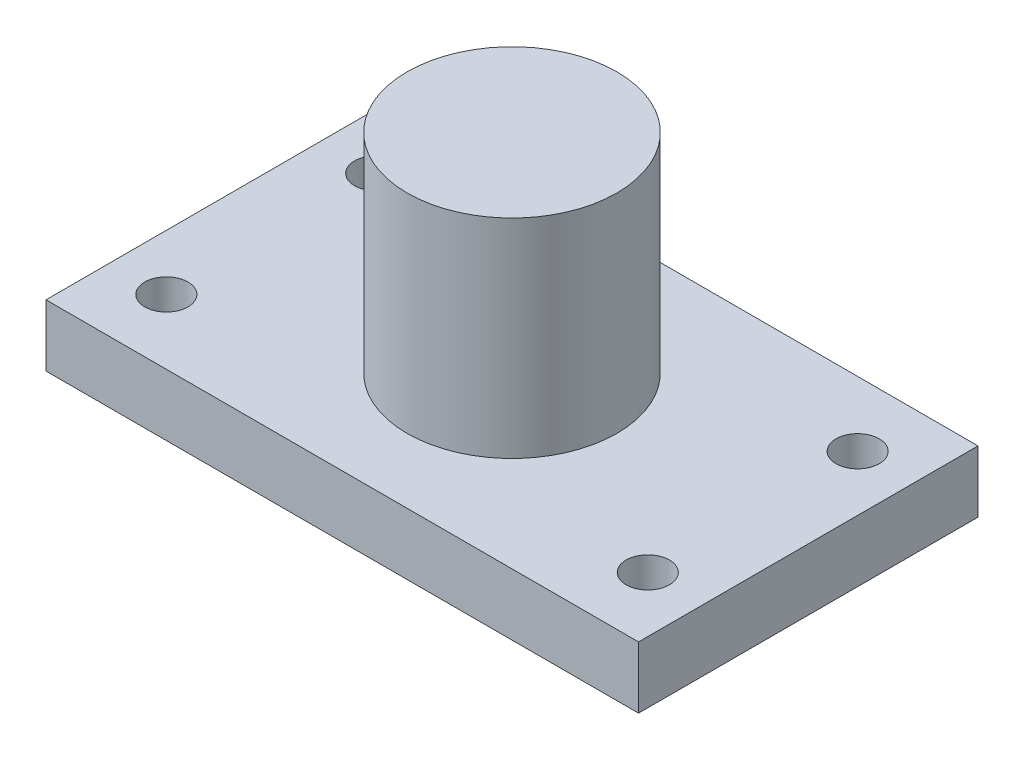
ISO-10303-21;
HEADER;
FILE_DESCRIPTION(('STEP AP214'),'2;1');
FILE_NAME('part.step','',(''),(''),'','','');
FILE_SCHEMA(('AUTOMOTIVE_DESIGN { 1 0 10303 214 1 1 1 1 }'));
ENDSEC;
DATA;
#1=APPLICATION_CONTEXT('core data for automotive mechanical design processes');
#2=APPLICATION_PROTOCOL_DEFINITION('international standard','automotive_design',2000,#1);
#3=PRODUCT_CONTEXT('',#1,'mechanical');
#4=PRODUCT('Part','Part','',(#3));
#5=PRODUCT_RELATED_PRODUCT_CATEGORY('part','',(#4));
#6=PRODUCT_DEFINITION_FORMATION('','',#4);
#7=PRODUCT_DEFINITION_CONTEXT('part definition',#1,'design');
#8=PRODUCT_DEFINITION('design','',#6,#7);
#9=PRODUCT_DEFINITION_SHAPE('','',#8);
#10=(LENGTH_UNIT() NAMED_UNIT(*) SI_UNIT(.MILLI.,.METRE.));
#11=(NAMED_UNIT(*) PLANE_ANGLE_UNIT() SI_UNIT($,.RADIAN.));
#12=(NAMED_UNIT(*) SI_UNIT($,.STERADIAN.) SOLID_ANGLE_UNIT());
#13=UNCERTAINTY_MEASURE_WITH_UNIT(LENGTH_MEASURE(1.E-05),#10,'distance_accuracy_value','');
#14=(GEOMETRIC_REPRESENTATION_CONTEXT(3) GLOBAL_UNCERTAINTY_ASSIGNED_CONTEXT((#13)) GLOBAL_UNIT_ASSIGNED_CONTEXT((#10,
#11,#12)) REPRESENTATION_CONTEXT('',''));
#15=CARTESIAN_POINT('',(0.,0.,0.));
#16=DIRECTION('',(0.,0.,1.));
#17=DIRECTION('',(1.,0.,0.));
#18=AXIS2_PLACEMENT_3D('',#15,#16,#17);
#19=CARTESIAN_POINT('',(0.,5.,0.));
#20=DIRECTION('',(1.,0.,0.));
#21=DIRECTION('',(0.,0.,-1.));
#22=AXIS2_PLACEMENT_3D('',#19,#20,#21);
#23=PLANE('',#22);
#24=DIRECTION('',(0.,0.,1.));
#25=VECTOR('',#24,1.);
#26=CARTESIAN_POINT('',(0.,0.,0.));
#27=LINE('',#26,#25);
#28=CARTESIAN_POINT('',(0.,0.,0.));
#29=VERTEX_POINT('',#28);
#30=CARTESIAN_POINT('',(0.,0.,27.5));
#31=VERTEX_POINT('',#30);
#32=EDGE_CURVE('E103',#29,#31,#27,.T.);
#33=ORIENTED_EDGE('',*,*,#32,.T.);
#34=DIRECTION('',(0.,-1.,0.));
#35=VECTOR('',#34,1.);
#36=CARTESIAN_POINT('',(0.,5.,27.5));
#37=LINE('',#36,#35);
#38=CARTESIAN_POINT('',(0.,5.,27.5));
#39=VERTEX_POINT('',#38);
#40=EDGE_CURVE('E44',#39,#31,#37,.T.);
#41=ORIENTED_EDGE('',*,*,#40,.F.);
#42=DIRECTION('',(0.,0.,1.));
#43=VECTOR('',#42,1.);
#44=CARTESIAN_POINT('',(0.,5.,0.));
#45=LINE('',#44,#43);
#46=CARTESIAN_POINT('',(0.,5.,0.));
#47=VERTEX_POINT('',#46);
#48=EDGE_CURVE('E89',#47,#39,#45,.T.);
#49=ORIENTED_EDGE('',*,*,#48,.F.);
#50=DIRECTION('',(0.,-1.,0.));
#51=VECTOR('',#50,1.);
#52=CARTESIAN_POINT('',(0.,5.,0.));
#53=LINE('',#52,#51);
#54=EDGE_CURVE('E99',#47,#29,#53,.T.);
#55=ORIENTED_EDGE('',*,*,#54,.T.);
#56=EDGE_LOOP('',(#33,#41,#49,#55));
#57=FACE_BOUND('',#56,.T.);
#58=ADVANCED_FACE('F35',(#57),#23,.F.);
#59=CARTESIAN_POINT('',(0.,5.,27.5));
#60=DIRECTION('',(0.,0.,-1.));
#61=DIRECTION('',(-1.,0.,0.));
#62=AXIS2_PLACEMENT_3D('',#59,#60,#61);
#63=PLANE('',#62);
#64=DIRECTION('',(1.,0.,0.));
#65=VECTOR('',#64,1.);
#66=CARTESIAN_POINT('',(0.,0.,27.5));
#67=LINE('',#66,#65);
#68=CARTESIAN_POINT('',(48.,0.,27.5));
#69=VERTEX_POINT('',#68);
#70=EDGE_CURVE('E94',#31,#69,#67,.T.);
#71=ORIENTED_EDGE('',*,*,#70,.T.);
#72=DIRECTION('',(0.,-1.,0.));
#73=VECTOR('',#72,1.);
#74=CARTESIAN_POINT('',(48.,5.,27.5));
#75=LINE('',#74,#73);
#76=CARTESIAN_POINT('',(48.,5.,27.5));
#77=VERTEX_POINT('',#76);
#78=EDGE_CURVE('E92',#77,#69,#75,.T.);
#79=ORIENTED_EDGE('',*,*,#78,.F.);
#80=DIRECTION('',(1.,0.,0.));
#81=VECTOR('',#80,1.);
#82=CARTESIAN_POINT('',(0.,5.,27.5));
#83=LINE('',#82,#81);
#84=EDGE_CURVE('E84',#39,#77,#83,.T.);
#85=ORIENTED_EDGE('',*,*,#84,.F.);
#86=ORIENTED_EDGE('',*,*,#40,.T.);
#87=EDGE_LOOP('',(#71,#79,#85,#86));
#88=FACE_BOUND('',#87,.T.);
#89=ADVANCED_FACE('F93',(#88),#63,.F.);
#90=CARTESIAN_POINT('',(48.,5.,0.));
#91=DIRECTION('',(-1.,0.,0.));
#92=DIRECTION('',(0.,0.,1.));
#93=AXIS2_PLACEMENT_3D('',#90,#91,#92);
#94=PLANE('',#93);
#95=DIRECTION('',(0.,0.,-1.));
#96=VECTOR('',#95,1.);
#97=CARTESIAN_POINT('',(48.,0.,0.));
#98=LINE('',#97,#96);
#99=CARTESIAN_POINT('',(48.,0.,0.));
#100=VERTEX_POINT('',#99);
#101=EDGE_CURVE('E70',#69,#100,#98,.T.);
#102=ORIENTED_EDGE('',*,*,#101,.T.);
#103=DIRECTION('',(0.,-1.,0.));
#104=VECTOR('',#103,1.);
#105=CARTESIAN_POINT('',(48.,5.,0.));
#106=LINE('',#105,#104);
#107=CARTESIAN_POINT('',(48.,5.,0.));
#108=VERTEX_POINT('',#107);
#109=EDGE_CURVE('E95',#108,#100,#106,.T.);
#110=ORIENTED_EDGE('',*,*,#109,.F.);
#111=DIRECTION('',(0.,0.,-1.));
#112=VECTOR('',#111,1.);
#113=CARTESIAN_POINT('',(48.,5.,0.));
#114=LINE('',#113,#112);
#115=EDGE_CURVE('E87',#77,#108,#114,.T.);
#116=ORIENTED_EDGE('',*,*,#115,.F.);
#117=ORIENTED_EDGE('',*,*,#78,.T.);
#118=EDGE_LOOP('',(#102,#110,#116,#117));
#119=FACE_BOUND('',#118,.T.);
#120=ADVANCED_FACE('F97',(#119),#94,.F.);
#121=CARTESIAN_POINT('',(0.,5.,0.));
#122=DIRECTION('',(0.,0.,1.));
#123=DIRECTION('',(1.,0.,0.));
#124=AXIS2_PLACEMENT_3D('',#121,#122,#123);
#125=PLANE('',#124);
#126=DIRECTION('',(-1.,0.,0.));
#127=VECTOR('',#126,1.);
#128=CARTESIAN_POINT('',(0.,0.,0.));
#129=LINE('',#128,#127);
#130=EDGE_CURVE('E76',#100,#29,#129,.T.);
#131=ORIENTED_EDGE('',*,*,#130,.T.);
#132=ORIENTED_EDGE('',*,*,#54,.F.);
#133=DIRECTION('',(-1.,0.,0.));
#134=VECTOR('',#133,1.);
#135=CARTESIAN_POINT('',(0.,5.,0.));
#136=LINE('',#135,#134);
#137=EDGE_CURVE('E53',#108,#47,#136,.T.);
#138=ORIENTED_EDGE('',*,*,#137,.F.);
#139=ORIENTED_EDGE('',*,*,#109,.T.);
#140=EDGE_LOOP('',(#131,#132,#138,#139));
#141=FACE_BOUND('',#140,.T.);
#142=ADVANCED_FACE('F149',(#141),#125,.F.);
#143=CARTESIAN_POINT('',(0.,5.,0.));
#144=DIRECTION('',(0.,1.,0.));
#145=DIRECTION('',(0.,0.,1.));
#146=AXIS2_PLACEMENT_3D('',#143,#144,#145);
#147=PLANE('',#146);
#148=CARTESIAN_POINT('',(4.5,5.,5.25));
#149=DIRECTION('',(0.,1.,0.));
#150=DIRECTION('',(0.,0.,1.));
#151=AXIS2_PLACEMENT_3D('',#148,#149,#150);
#152=CIRCLE('',#151,1.75);
#153=CARTESIAN_POINT('',(4.5,5.,3.5));
#154=VERTEX_POINT('',#153);
#155=EDGE_CURVE('E133',#154,#154,#152,.T.);
#156=ORIENTED_EDGE('',*,*,#155,.F.);
#157=EDGE_LOOP('',(#156));
#158=FACE_BOUND('',#157,.T.);
#159=CARTESIAN_POINT('',(43.5,5.,5.24999999999999));
#160=DIRECTION('',(0.,1.,0.));
#161=DIRECTION('',(0.,0.,1.));
#162=AXIS2_PLACEMENT_3D('',#159,#160,#161);
#163=CIRCLE('',#162,1.75);
#164=CARTESIAN_POINT('',(43.5,5.,3.49999999999998));
#165=VERTEX_POINT('',#164);
#166=EDGE_CURVE('E122',#165,#165,#163,.T.);
#167=ORIENTED_EDGE('',*,*,#166,.F.);
#168=EDGE_LOOP('',(#167));
#169=FACE_BOUND('',#168,.T.);
#170=CARTESIAN_POINT('',(43.5,5.,22.25));
#171=DIRECTION('',(0.,1.,0.));
#172=DIRECTION('',(0.,0.,1.));
#173=AXIS2_PLACEMENT_3D('',#170,#171,#172);
#174=CIRCLE('',#173,1.75);
#175=CARTESIAN_POINT('',(43.5,5.,20.5));
#176=VERTEX_POINT('',#175);
#177=EDGE_CURVE('E119',#176,#176,#174,.T.);
#178=ORIENTED_EDGE('',*,*,#177,.F.);
#179=EDGE_LOOP('',(#178));
#180=FACE_BOUND('',#179,.T.);
#181=CARTESIAN_POINT('',(4.5,5.,22.25));
#182=DIRECTION('',(0.,1.,0.));
#183=DIRECTION('',(0.,0.,1.));
#184=AXIS2_PLACEMENT_3D('',#181,#182,#183);
#185=CIRCLE('',#184,1.75);
#186=CARTESIAN_POINT('',(4.5,5.,20.5));
#187=VERTEX_POINT('',#186);
#188=EDGE_CURVE('E116',#187,#187,#185,.T.);
#189=ORIENTED_EDGE('',*,*,#188,.F.);
#190=EDGE_LOOP('',(#189));
#191=FACE_BOUND('',#190,.T.);
#192=CARTESIAN_POINT('',(24.,5.,13.75));
#193=DIRECTION('',(0.,1.,0.));
#194=DIRECTION('',(0.,0.,1.));
#195=AXIS2_PLACEMENT_3D('',#192,#193,#194);
#196=CIRCLE('',#195,8.5);
#197=CARTESIAN_POINT('',(24.,5.,22.25));
#198=VERTEX_POINT('',#197);
#199=EDGE_CURVE('E11',#198,#198,#196,.T.);
#200=ORIENTED_EDGE('',*,*,#199,.F.);
#201=EDGE_LOOP('',(#200));
#202=FACE_BOUND('',#201,.T.);
#203=ORIENTED_EDGE('',*,*,#48,.T.);
#204=ORIENTED_EDGE('',*,*,#84,.T.);
#205=ORIENTED_EDGE('',*,*,#115,.T.);
#206=ORIENTED_EDGE('',*,*,#137,.T.);
#207=EDGE_LOOP('',(#203,#204,#205,#206));
#208=FACE_BOUND('',#207,.T.);
#209=ADVANCED_FACE('F85',(#158,#169,#180,#191,#202,#208),#147,.T.);
#210=CARTESIAN_POINT('',(0.,0.,0.));
#211=DIRECTION('',(0.,1.,0.));
#212=DIRECTION('',(0.,0.,1.));
#213=AXIS2_PLACEMENT_3D('',#210,#211,#212);
#214=PLANE('',#213);
#215=CARTESIAN_POINT('',(4.5,0.,5.25));
#216=DIRECTION('',(0.,1.,0.));
#217=DIRECTION('',(0.,0.,1.));
#218=AXIS2_PLACEMENT_3D('',#215,#216,#217);
#219=CIRCLE('',#218,1.75);
#220=CARTESIAN_POINT('',(4.5,0.,3.5));
#221=VERTEX_POINT('',#220);
#222=EDGE_CURVE('E38',#221,#221,#219,.T.);
#223=ORIENTED_EDGE('',*,*,#222,.T.);
#224=EDGE_LOOP('',(#223));
#225=FACE_BOUND('',#224,.T.);
#226=CARTESIAN_POINT('',(43.5,0.,5.24999999999999));
#227=DIRECTION('',(0.,1.,0.));
#228=DIRECTION('',(0.,0.,1.));
#229=AXIS2_PLACEMENT_3D('',#226,#227,#228);
#230=CIRCLE('',#229,1.75);
#231=CARTESIAN_POINT('',(43.5,0.,3.49999999999998));
#232=VERTEX_POINT('',#231);
#233=EDGE_CURVE('E120',#232,#232,#230,.T.);
#234=ORIENTED_EDGE('',*,*,#233,.T.);
#235=EDGE_LOOP('',(#234));
#236=FACE_BOUND('',#235,.T.);
#237=CARTESIAN_POINT('',(43.5,0.,22.25));
#238=DIRECTION('',(0.,1.,0.));
#239=DIRECTION('',(0.,0.,1.));
#240=AXIS2_PLACEMENT_3D('',#237,#238,#239);
#241=CIRCLE('',#240,1.75);
#242=CARTESIAN_POINT('',(43.5,0.,20.5));
#243=VERTEX_POINT('',#242);
#244=EDGE_CURVE('E117',#243,#243,#241,.T.);
#245=ORIENTED_EDGE('',*,*,#244,.T.);
#246=EDGE_LOOP('',(#245));
#247=FACE_BOUND('',#246,.T.);
#248=CARTESIAN_POINT('',(4.5,0.,22.25));
#249=DIRECTION('',(0.,1.,0.));
#250=DIRECTION('',(0.,0.,1.));
#251=AXIS2_PLACEMENT_3D('',#248,#249,#250);
#252=CIRCLE('',#251,1.75);
#253=CARTESIAN_POINT('',(4.5,0.,20.5));
#254=VERTEX_POINT('',#253);
#255=EDGE_CURVE('E113',#254,#254,#252,.T.);
#256=ORIENTED_EDGE('',*,*,#255,.T.);
#257=EDGE_LOOP('',(#256));
#258=FACE_BOUND('',#257,.T.);
#259=ORIENTED_EDGE('',*,*,#32,.F.);
#260=ORIENTED_EDGE('',*,*,#130,.F.);
#261=ORIENTED_EDGE('',*,*,#101,.F.);
#262=ORIENTED_EDGE('',*,*,#70,.F.);
#263=EDGE_LOOP('',(#259,#260,#261,#262));
#264=FACE_BOUND('',#263,.T.);
#265=ADVANCED_FACE('F144',(#225,#236,#247,#258,#264),#214,.F.);
#266=CARTESIAN_POINT('',(24.,21.87,13.75));
#267=DIRECTION('',(0.,-1.,0.));
#268=DIRECTION('',(0.,0.,-1.));
#269=AXIS2_PLACEMENT_3D('',#266,#267,#268);
#270=CYLINDRICAL_SURFACE('',#269,8.5);
#271=CARTESIAN_POINT('',(24.,21.87,13.75));
#272=DIRECTION('',(0.,1.,0.));
#273=DIRECTION('',(0.,0.,1.));
#274=AXIS2_PLACEMENT_3D('',#271,#272,#273);
#275=CIRCLE('',#274,8.5);
#276=CARTESIAN_POINT('',(24.,21.87,22.25));
#277=VERTEX_POINT('',#276);
#278=EDGE_CURVE('E106',#277,#277,#275,.T.);
#279=ORIENTED_EDGE('',*,*,#278,.F.);
#280=EDGE_LOOP('',(#279));
#281=FACE_BOUND('',#280,.T.);
#282=ORIENTED_EDGE('',*,*,#199,.T.);
#283=EDGE_LOOP('',(#282));
#284=FACE_BOUND('',#283,.T.);
#285=ADVANCED_FACE('F141',(#281,#284),#270,.T.);
#286=CARTESIAN_POINT('',(24.,21.87,13.75));
#287=DIRECTION('',(0.,1.,0.));
#288=DIRECTION('',(0.,0.,1.));
#289=AXIS2_PLACEMENT_3D('',#286,#287,#288);
#290=PLANE('',#289);
#291=ORIENTED_EDGE('',*,*,#278,.T.);
#292=EDGE_LOOP('',(#291));
#293=FACE_BOUND('',#292,.T.);
#294=ADVANCED_FACE('F139',(#293),#290,.T.);
#295=CARTESIAN_POINT('',(4.5,21.87,22.25));
#296=DIRECTION('',(0.,-1.,0.));
#297=DIRECTION('',(0.,0.,-1.));
#298=AXIS2_PLACEMENT_3D('',#295,#296,#297);
#299=CYLINDRICAL_SURFACE('',#298,1.75);
#300=CARTESIAN_POINT('',(4.5,5.,20.5));
#301=CARTESIAN_POINT('',(4.5,4.94791666666667,20.5));
#302=CARTESIAN_POINT('',(4.5,4.89583333333333,20.5));
#303=CARTESIAN_POINT('',(4.5,4.79166666666667,20.5));
#304=CARTESIAN_POINT('',(4.5,4.73958333333333,20.5));
#305=CARTESIAN_POINT('',(4.5,4.63541666666667,20.5));
#306=CARTESIAN_POINT('',(4.5,4.58333333333333,20.5));
#307=CARTESIAN_POINT('',(4.5,4.47916666666667,20.5));
#308=CARTESIAN_POINT('',(4.5,4.42708333333333,20.5));
#309=CARTESIAN_POINT('',(4.5,4.32291666666667,20.5));
#310=CARTESIAN_POINT('',(4.5,4.27083333333333,20.5));
#311=CARTESIAN_POINT('',(4.5,4.16666666666667,20.5));
#312=CARTESIAN_POINT('',(4.5,4.11458333333333,20.5));
#313=CARTESIAN_POINT('',(4.5,4.01041666666667,20.5));
#314=CARTESIAN_POINT('',(4.5,3.95833333333333,20.5));
#315=CARTESIAN_POINT('',(4.5,3.85416666666667,20.5));
#316=CARTESIAN_POINT('',(4.5,3.80208333333333,20.5));
#317=CARTESIAN_POINT('',(4.5,3.69791666666667,20.5));
#318=CARTESIAN_POINT('',(4.5,3.64583333333333,20.5));
#319=CARTESIAN_POINT('',(4.5,3.54166666666667,20.5));
#320=CARTESIAN_POINT('',(4.5,3.48958333333333,20.5));
#321=CARTESIAN_POINT('',(4.5,3.38541666666667,20.5));
#322=CARTESIAN_POINT('',(4.5,3.33333333333333,20.5));
#323=CARTESIAN_POINT('',(4.5,3.22916666666667,20.5));
#324=CARTESIAN_POINT('',(4.5,3.17708333333333,20.5));
#325=CARTESIAN_POINT('',(4.5,3.07291666666667,20.5));
#326=CARTESIAN_POINT('',(4.5,3.02083333333333,20.5));
#327=CARTESIAN_POINT('',(4.5,2.91666666666667,20.5));
#328=CARTESIAN_POINT('',(4.5,2.86458333333333,20.5));
#329=CARTESIAN_POINT('',(4.5,2.76041666666667,20.5));
#330=CARTESIAN_POINT('',(4.5,2.70833333333333,20.5));
#331=CARTESIAN_POINT('',(4.5,2.60416666666667,20.5));
#332=CARTESIAN_POINT('',(4.5,2.55208333333333,20.5));
#333=CARTESIAN_POINT('',(4.5,2.44791666666667,20.5));
#334=CARTESIAN_POINT('',(4.5,2.39583333333333,20.5));
#335=CARTESIAN_POINT('',(4.5,2.29166666666667,20.5));
#336=CARTESIAN_POINT('',(4.5,2.23958333333333,20.5));
#337=CARTESIAN_POINT('',(4.5,2.13541666666667,20.5));
#338=CARTESIAN_POINT('',(4.5,2.08333333333333,20.5));
#339=CARTESIAN_POINT('',(4.5,1.97916666666667,20.5));
#340=CARTESIAN_POINT('',(4.5,1.92708333333333,20.5));
#341=CARTESIAN_POINT('',(4.5,1.82291666666666,20.5));
#342=CARTESIAN_POINT('',(4.5,1.77083333333333,20.5));
#343=CARTESIAN_POINT('',(4.5,1.66666666666666,20.5));
#344=CARTESIAN_POINT('',(4.5,1.61458333333333,20.5));
#345=CARTESIAN_POINT('',(4.5,1.51041666666666,20.5));
#346=CARTESIAN_POINT('',(4.5,1.45833333333333,20.5));
#347=CARTESIAN_POINT('',(4.5,1.35416666666666,20.5));
#348=CARTESIAN_POINT('',(4.5,1.30208333333333,20.5));
#349=CARTESIAN_POINT('',(4.5,1.19791666666666,20.5));
#350=CARTESIAN_POINT('',(4.5,1.14583333333333,20.5));
#351=CARTESIAN_POINT('',(4.5,1.04166666666666,20.5));
#352=CARTESIAN_POINT('',(4.5,0.989583333333331,20.5));
#353=CARTESIAN_POINT('',(4.5,0.885416666666664,20.5));
#354=CARTESIAN_POINT('',(4.5,0.833333333333331,20.5));
#355=CARTESIAN_POINT('',(4.5,0.729166666666664,20.5));
#356=CARTESIAN_POINT('',(4.5,0.67708333333333,20.5));
#357=CARTESIAN_POINT('',(4.5,0.572916666666664,20.5));
#358=CARTESIAN_POINT('',(4.5,0.52083333333333,20.5));
#359=CARTESIAN_POINT('',(4.5,0.416666666666664,20.5));
#360=CARTESIAN_POINT('',(4.5,0.36458333333333,20.5));
#361=CARTESIAN_POINT('',(4.5,0.260416666666663,20.5));
#362=CARTESIAN_POINT('',(4.5,0.20833333333333,20.5));
#363=CARTESIAN_POINT('',(4.5,0.104166666666663,20.5));
#364=CARTESIAN_POINT('',(4.5,0.05208333333333,20.5));
#365=CARTESIAN_POINT('',(4.5,0.,20.5));
#366=B_SPLINE_CURVE_WITH_KNOTS('',3,(#300,#301,#302,#303,#304,#305,#306,#307,#308,#309,#310,
#311,#312,#313,#314,#315,#316,#317,#318,#319,#320,#321,#322,#323,#324,#325,#326,#327,#328,#329,
#330,#331,#332,#333,#334,#335,#336,#337,#338,#339,#340,#341,#342,#343,#344,#345,#346,#347,#348,
#349,#350,#351,#352,#353,#354,#355,#356,#357,#358,#359,#360,#361,#362,#363,#364,#365),
.UNSPECIFIED.,.F.,.F.,(4,2,2,2,2,2,2,2,2,2,2,2,2,2,2,2,2,2,2,2,2,2,2,2,2,2,2,2,2,2,2,2,4),(0.,
0.15625,0.3125,0.46875,0.625000000000001,0.781250000000001,0.937500000000001,1.09375,1.25,
1.40625,1.5625,1.71875,1.875,2.03125,2.1875,2.34375,2.5,2.65625,2.8125,2.96875,3.125,3.28125,
3.4375,3.59375,3.75,3.90625,4.0625,4.21875,4.375,4.53125,4.6875,4.84375,5.),.UNSPECIFIED.);
#367=EDGE_CURVE('BSEAM199',#187,#254,#366,.T.);
#368=ORIENTED_EDGE('',*,*,#188,.T.);
#369=ORIENTED_EDGE('',*,*,#255,.F.);
#370=ORIENTED_EDGE('',*,*,#367,.T.);
#371=ORIENTED_EDGE('',*,*,#367,.F.);
#372=EDGE_LOOP('',(#368,#370,#369,#371));
#373=FACE_BOUND('',#372,.T.);
#374=ADVANCED_FACE('F199',(#373),#299,.F.);
#375=CARTESIAN_POINT('',(43.5,21.87,22.25));
#376=DIRECTION('',(0.,-1.,0.));
#377=DIRECTION('',(0.,0.,-1.));
#378=AXIS2_PLACEMENT_3D('',#375,#376,#377);
#379=CYLINDRICAL_SURFACE('',#378,1.75);
#380=CARTESIAN_POINT('',(43.5,5.,20.5));
#381=CARTESIAN_POINT('',(43.5,4.94791666666667,20.5));
#382=CARTESIAN_POINT('',(43.5,4.89583333333333,20.5));
#383=CARTESIAN_POINT('',(43.5,4.79166666666667,20.5));
#384=CARTESIAN_POINT('',(43.5,4.73958333333333,20.5));
#385=CARTESIAN_POINT('',(43.5,4.63541666666667,20.5));
#386=CARTESIAN_POINT('',(43.5,4.58333333333333,20.5));
#387=CARTESIAN_POINT('',(43.5,4.47916666666667,20.5));
#388=CARTESIAN_POINT('',(43.5,4.42708333333333,20.5));
#389=CARTESIAN_POINT('',(43.5,4.32291666666667,20.5));
#390=CARTESIAN_POINT('',(43.5,4.27083333333333,20.5));
#391=CARTESIAN_POINT('',(43.5,4.16666666666667,20.5));
#392=CARTESIAN_POINT('',(43.5,4.11458333333333,20.5));
#393=CARTESIAN_POINT('',(43.5,4.01041666666667,20.5));
#394=CARTESIAN_POINT('',(43.5,3.95833333333333,20.5));
#395=CARTESIAN_POINT('',(43.5,3.85416666666667,20.5));
#396=CARTESIAN_POINT('',(43.5,3.80208333333333,20.5));
#397=CARTESIAN_POINT('',(43.5,3.69791666666667,20.5));
#398=CARTESIAN_POINT('',(43.5,3.64583333333333,20.5));
#399=CARTESIAN_POINT('',(43.5,3.54166666666667,20.5));
#400=CARTESIAN_POINT('',(43.5,3.48958333333333,20.5));
#401=CARTESIAN_POINT('',(43.5,3.38541666666667,20.5));
#402=CARTESIAN_POINT('',(43.5,3.33333333333333,20.5));
#403=CARTESIAN_POINT('',(43.5,3.22916666666667,20.5));
#404=CARTESIAN_POINT('',(43.5,3.17708333333333,20.5));
#405=CARTESIAN_POINT('',(43.5,3.07291666666667,20.5));
#406=CARTESIAN_POINT('',(43.5,3.02083333333333,20.5));
#407=CARTESIAN_POINT('',(43.5,2.91666666666667,20.5));
#408=CARTESIAN_POINT('',(43.5,2.86458333333333,20.5));
#409=CARTESIAN_POINT('',(43.5,2.76041666666667,20.5));
#410=CARTESIAN_POINT('',(43.5,2.70833333333333,20.5));
#411=CARTESIAN_POINT('',(43.5,2.60416666666667,20.5));
#412=CARTESIAN_POINT('',(43.5,2.55208333333333,20.5));
#413=CARTESIAN_POINT('',(43.5,2.44791666666667,20.5));
#414=CARTESIAN_POINT('',(43.5,2.39583333333333,20.5));
#415=CARTESIAN_POINT('',(43.5,2.29166666666667,20.5));
#416=CARTESIAN_POINT('',(43.5,2.23958333333333,20.5));
#417=CARTESIAN_POINT('',(43.5,2.13541666666667,20.5));
#418=CARTESIAN_POINT('',(43.5,2.08333333333333,20.5));
#419=CARTESIAN_POINT('',(43.5,1.97916666666667,20.5));
#420=CARTESIAN_POINT('',(43.5,1.92708333333333,20.5));
#421=CARTESIAN_POINT('',(43.5,1.82291666666666,20.5));
#422=CARTESIAN_POINT('',(43.5,1.77083333333333,20.5));
#423=CARTESIAN_POINT('',(43.5,1.66666666666666,20.5));
#424=CARTESIAN_POINT('',(43.5,1.61458333333333,20.5));
#425=CARTESIAN_POINT('',(43.5,1.51041666666666,20.5));
#426=CARTESIAN_POINT('',(43.5,1.45833333333333,20.5));
#427=CARTESIAN_POINT('',(43.5,1.35416666666666,20.5));
#428=CARTESIAN_POINT('',(43.5,1.30208333333333,20.5));
#429=CARTESIAN_POINT('',(43.5,1.19791666666666,20.5));
#430=CARTESIAN_POINT('',(43.5,1.14583333333333,20.5));
#431=CARTESIAN_POINT('',(43.5,1.04166666666666,20.5));
#432=CARTESIAN_POINT('',(43.5,0.989583333333331,20.5));
#433=CARTESIAN_POINT('',(43.5,0.885416666666664,20.5));
#434=CARTESIAN_POINT('',(43.5,0.833333333333331,20.5));
#435=CARTESIAN_POINT('',(43.5,0.729166666666664,20.5));
#436=CARTESIAN_POINT('',(43.5,0.67708333333333,20.5));
#437=CARTESIAN_POINT('',(43.5,0.572916666666664,20.5));
#438=CARTESIAN_POINT('',(43.5,0.52083333333333,20.5));
#439=CARTESIAN_POINT('',(43.5,0.416666666666664,20.5));
#440=CARTESIAN_POINT('',(43.5,0.36458333333333,20.5));
#441=CARTESIAN_POINT('',(43.5,0.260416666666663,20.5));
#442=CARTESIAN_POINT('',(43.5,0.20833333333333,20.5));
#443=CARTESIAN_POINT('',(43.5,0.104166666666663,20.5));
#444=CARTESIAN_POINT('',(43.5,0.05208333333333,20.5));
#445=CARTESIAN_POINT('',(43.5,0.,20.5));
#446=B_SPLINE_CURVE_WITH_KNOTS('',3,(#380,#381,#382,#383,#384,#385,#386,#387,#388,#389,#390,
#391,#392,#393,#394,#395,#396,#397,#398,#399,#400,#401,#402,#403,#404,#405,#406,#407,#408,#409,
#410,#411,#412,#413,#414,#415,#416,#417,#418,#419,#420,#421,#422,#423,#424,#425,#426,#427,#428,
#429,#430,#431,#432,#433,#434,#435,#436,#437,#438,#439,#440,#441,#442,#443,#444,#445),
.UNSPECIFIED.,.F.,.F.,(4,2,2,2,2,2,2,2,2,2,2,2,2,2,2,2,2,2,2,2,2,2,2,2,2,2,2,2,2,2,2,2,4),(0.,
0.15625,0.3125,0.46875,0.625000000000001,0.781250000000001,0.937500000000001,1.09375,1.25,
1.40625,1.5625,1.71875,1.875,2.03125,2.1875,2.34375,2.5,2.65625,2.8125,2.96875,3.125,3.28125,
3.4375,3.59375,3.75,3.90625,4.0625,4.21875,4.375,4.53125,4.6875,4.84375,5.),.UNSPECIFIED.);
#447=EDGE_CURVE('BSEAM205',#176,#243,#446,.T.);
#448=ORIENTED_EDGE('',*,*,#177,.T.);
#449=ORIENTED_EDGE('',*,*,#244,.F.);
#450=ORIENTED_EDGE('',*,*,#447,.T.);
#451=ORIENTED_EDGE('',*,*,#447,.F.);
#452=EDGE_LOOP('',(#448,#450,#449,#451));
#453=FACE_BOUND('',#452,.T.);
#454=ADVANCED_FACE('F205',(#453),#379,.F.);
#455=CARTESIAN_POINT('',(43.5,21.87,5.24999999999999));
#456=DIRECTION('',(0.,-1.,0.));
#457=DIRECTION('',(0.,0.,-1.));
#458=AXIS2_PLACEMENT_3D('',#455,#456,#457);
#459=CYLINDRICAL_SURFACE('',#458,1.75);
#460=CARTESIAN_POINT('',(43.5,5.,3.49999999999998));
#461=CARTESIAN_POINT('',(43.5,4.94791666666667,3.49999999999998));
#462=CARTESIAN_POINT('',(43.5,4.89583333333333,3.49999999999998));
#463=CARTESIAN_POINT('',(43.5,4.79166666666667,3.49999999999998));
#464=CARTESIAN_POINT('',(43.5,4.73958333333333,3.49999999999998));
#465=CARTESIAN_POINT('',(43.5,4.63541666666667,3.49999999999998));
#466=CARTESIAN_POINT('',(43.5,4.58333333333333,3.49999999999998));
#467=CARTESIAN_POINT('',(43.5,4.47916666666667,3.49999999999998));
#468=CARTESIAN_POINT('',(43.5,4.42708333333333,3.49999999999998));
#469=CARTESIAN_POINT('',(43.5,4.32291666666667,3.49999999999998));
#470=CARTESIAN_POINT('',(43.5,4.27083333333333,3.49999999999998));
#471=CARTESIAN_POINT('',(43.5,4.16666666666667,3.49999999999998));
#472=CARTESIAN_POINT('',(43.5,4.11458333333333,3.49999999999998));
#473=CARTESIAN_POINT('',(43.5,4.01041666666667,3.49999999999998));
#474=CARTESIAN_POINT('',(43.5,3.95833333333333,3.49999999999998));
#475=CARTESIAN_POINT('',(43.5,3.85416666666667,3.49999999999998));
#476=CARTESIAN_POINT('',(43.5,3.80208333333333,3.49999999999998));
#477=CARTESIAN_POINT('',(43.5,3.69791666666667,3.49999999999998));
#478=CARTESIAN_POINT('',(43.5,3.64583333333333,3.49999999999998));
#479=CARTESIAN_POINT('',(43.5,3.54166666666667,3.49999999999998));
#480=CARTESIAN_POINT('',(43.5,3.48958333333333,3.49999999999998));
#481=CARTESIAN_POINT('',(43.5,3.38541666666667,3.49999999999998));
#482=CARTESIAN_POINT('',(43.5,3.33333333333333,3.49999999999998));
#483=CARTESIAN_POINT('',(43.5,3.22916666666667,3.49999999999998));
#484=CARTESIAN_POINT('',(43.5,3.17708333333333,3.49999999999998));
#485=CARTESIAN_POINT('',(43.5,3.07291666666667,3.49999999999998));
#486=CARTESIAN_POINT('',(43.5,3.02083333333333,3.49999999999998));
#487=CARTESIAN_POINT('',(43.5,2.91666666666667,3.49999999999998));
#488=CARTESIAN_POINT('',(43.5,2.86458333333333,3.49999999999998));
#489=CARTESIAN_POINT('',(43.5,2.76041666666667,3.49999999999998));
#490=CARTESIAN_POINT('',(43.5,2.70833333333333,3.49999999999998));
#491=CARTESIAN_POINT('',(43.5,2.60416666666667,3.49999999999998));
#492=CARTESIAN_POINT('',(43.5,2.55208333333333,3.49999999999998));
#493=CARTESIAN_POINT('',(43.5,2.44791666666667,3.49999999999998));
#494=CARTESIAN_POINT('',(43.5,2.39583333333333,3.49999999999998));
#495=CARTESIAN_POINT('',(43.5,2.29166666666667,3.49999999999998));
#496=CARTESIAN_POINT('',(43.5,2.23958333333333,3.49999999999998));
#497=CARTESIAN_POINT('',(43.5,2.13541666666667,3.49999999999998));
#498=CARTESIAN_POINT('',(43.5,2.08333333333333,3.49999999999998));
#499=CARTESIAN_POINT('',(43.5,1.97916666666667,3.49999999999998));
#500=CARTESIAN_POINT('',(43.5,1.92708333333333,3.49999999999998));
#501=CARTESIAN_POINT('',(43.5,1.82291666666666,3.49999999999998));
#502=CARTESIAN_POINT('',(43.5,1.77083333333333,3.49999999999998));
#503=CARTESIAN_POINT('',(43.5,1.66666666666666,3.49999999999998));
#504=CARTESIAN_POINT('',(43.5,1.61458333333333,3.49999999999998));
#505=CARTESIAN_POINT('',(43.5,1.51041666666666,3.49999999999998));
#506=CARTESIAN_POINT('',(43.5,1.45833333333333,3.49999999999998));
#507=CARTESIAN_POINT('',(43.5,1.35416666666666,3.49999999999998));
#508=CARTESIAN_POINT('',(43.5,1.30208333333333,3.49999999999998));
#509=CARTESIAN_POINT('',(43.5,1.19791666666666,3.49999999999998));
#510=CARTESIAN_POINT('',(43.5,1.14583333333333,3.49999999999998));
#511=CARTESIAN_POINT('',(43.5,1.04166666666666,3.49999999999998));
#512=CARTESIAN_POINT('',(43.5,0.989583333333331,3.49999999999998));
#513=CARTESIAN_POINT('',(43.5,0.885416666666664,3.49999999999998));
#514=CARTESIAN_POINT('',(43.5,0.833333333333331,3.49999999999998));
#515=CARTESIAN_POINT('',(43.5,0.729166666666664,3.49999999999998));
#516=CARTESIAN_POINT('',(43.5,0.67708333333333,3.49999999999998));
#517=CARTESIAN_POINT('',(43.5,0.572916666666664,3.49999999999998));
#518=CARTESIAN_POINT('',(43.5,0.52083333333333,3.49999999999998));
#519=CARTESIAN_POINT('',(43.5,0.416666666666664,3.49999999999998));
#520=CARTESIAN_POINT('',(43.5,0.36458333333333,3.49999999999998));
#521=CARTESIAN_POINT('',(43.5,0.260416666666663,3.49999999999998));
#522=CARTESIAN_POINT('',(43.5,0.20833333333333,3.49999999999998));
#523=CARTESIAN_POINT('',(43.5,0.104166666666663,3.49999999999998));
#524=CARTESIAN_POINT('',(43.5,0.05208333333333,3.49999999999998));
#525=CARTESIAN_POINT('',(43.5,0.,3.49999999999998));
#526=B_SPLINE_CURVE_WITH_KNOTS('',3,(#460,#461,#462,#463,#464,#465,#466,#467,#468,#469,#470,
#471,#472,#473,#474,#475,#476,#477,#478,#479,#480,#481,#482,#483,#484,#485,#486,#487,#488,#489,
#490,#491,#492,#493,#494,#495,#496,#497,#498,#499,#500,#501,#502,#503,#504,#505,#506,#507,#508,
#509,#510,#511,#512,#513,#514,#515,#516,#517,#518,#519,#520,#521,#522,#523,#524,#525),
.UNSPECIFIED.,.F.,.F.,(4,2,2,2,2,2,2,2,2,2,2,2,2,2,2,2,2,2,2,2,2,2,2,2,2,2,2,2,2,2,2,2,4),(0.,
0.15625,0.3125,0.46875,0.625000000000001,0.781250000000001,0.937500000000001,1.09375,1.25,
1.40625,1.5625,1.71875,1.875,2.03125,2.1875,2.34375,2.5,2.65625,2.8125,2.96875,3.125,3.28125,
3.4375,3.59375,3.75,3.90625,4.0625,4.21875,4.375,4.53125,4.6875,4.84375,5.),.UNSPECIFIED.);
#527=EDGE_CURVE('BSEAM213',#165,#232,#526,.T.);
#528=ORIENTED_EDGE('',*,*,#166,.T.);
#529=ORIENTED_EDGE('',*,*,#233,.F.);
#530=ORIENTED_EDGE('',*,*,#527,.T.);
#531=ORIENTED_EDGE('',*,*,#527,.F.);
#532=EDGE_LOOP('',(#528,#530,#529,#531));
#533=FACE_BOUND('',#532,.T.);
#534=ADVANCED_FACE('F213',(#533),#459,.F.);
#535=CARTESIAN_POINT('',(4.5,21.87,5.25));
#536=DIRECTION('',(0.,-1.,0.));
#537=DIRECTION('',(0.,0.,-1.));
#538=AXIS2_PLACEMENT_3D('',#535,#536,#537);
#539=CYLINDRICAL_SURFACE('',#538,1.75);
#540=CARTESIAN_POINT('',(4.5,5.,3.5));
#541=CARTESIAN_POINT('',(4.5,4.94791666666667,3.5));
#542=CARTESIAN_POINT('',(4.5,4.89583333333333,3.5));
#543=CARTESIAN_POINT('',(4.5,4.79166666666667,3.5));
#544=CARTESIAN_POINT('',(4.5,4.73958333333333,3.5));
#545=CARTESIAN_POINT('',(4.5,4.63541666666667,3.5));
#546=CARTESIAN_POINT('',(4.5,4.58333333333333,3.5));
#547=CARTESIAN_POINT('',(4.5,4.47916666666667,3.5));
#548=CARTESIAN_POINT('',(4.5,4.42708333333333,3.5));
#549=CARTESIAN_POINT('',(4.5,4.32291666666667,3.5));
#550=CARTESIAN_POINT('',(4.5,4.27083333333333,3.5));
#551=CARTESIAN_POINT('',(4.5,4.16666666666667,3.5));
#552=CARTESIAN_POINT('',(4.5,4.11458333333333,3.5));
#553=CARTESIAN_POINT('',(4.5,4.01041666666667,3.5));
#554=CARTESIAN_POINT('',(4.5,3.95833333333333,3.5));
#555=CARTESIAN_POINT('',(4.5,3.85416666666667,3.5));
#556=CARTESIAN_POINT('',(4.5,3.80208333333333,3.5));
#557=CARTESIAN_POINT('',(4.5,3.69791666666667,3.5));
#558=CARTESIAN_POINT('',(4.5,3.64583333333333,3.5));
#559=CARTESIAN_POINT('',(4.5,3.54166666666667,3.5));
#560=CARTESIAN_POINT('',(4.5,3.48958333333333,3.5));
#561=CARTESIAN_POINT('',(4.5,3.38541666666667,3.5));
#562=CARTESIAN_POINT('',(4.5,3.33333333333333,3.5));
#563=CARTESIAN_POINT('',(4.5,3.22916666666667,3.5));
#564=CARTESIAN_POINT('',(4.5,3.17708333333333,3.5));
#565=CARTESIAN_POINT('',(4.5,3.07291666666667,3.5));
#566=CARTESIAN_POINT('',(4.5,3.02083333333333,3.5));
#567=CARTESIAN_POINT('',(4.5,2.91666666666667,3.5));
#568=CARTESIAN_POINT('',(4.5,2.86458333333333,3.5));
#569=CARTESIAN_POINT('',(4.5,2.76041666666667,3.5));
#570=CARTESIAN_POINT('',(4.5,2.70833333333333,3.5));
#571=CARTESIAN_POINT('',(4.5,2.60416666666667,3.5));
#572=CARTESIAN_POINT('',(4.5,2.55208333333333,3.5));
#573=CARTESIAN_POINT('',(4.5,2.44791666666667,3.5));
#574=CARTESIAN_POINT('',(4.5,2.39583333333333,3.5));
#575=CARTESIAN_POINT('',(4.5,2.29166666666667,3.5));
#576=CARTESIAN_POINT('',(4.5,2.23958333333333,3.5));
#577=CARTESIAN_POINT('',(4.5,2.13541666666667,3.5));
#578=CARTESIAN_POINT('',(4.5,2.08333333333333,3.5));
#579=CARTESIAN_POINT('',(4.5,1.97916666666667,3.5));
#580=CARTESIAN_POINT('',(4.5,1.92708333333333,3.5));
#581=CARTESIAN_POINT('',(4.5,1.82291666666666,3.5));
#582=CARTESIAN_POINT('',(4.5,1.77083333333333,3.5));
#583=CARTESIAN_POINT('',(4.5,1.66666666666666,3.5));
#584=CARTESIAN_POINT('',(4.5,1.61458333333333,3.5));
#585=CARTESIAN_POINT('',(4.5,1.51041666666666,3.5));
#586=CARTESIAN_POINT('',(4.5,1.45833333333333,3.5));
#587=CARTESIAN_POINT('',(4.5,1.35416666666666,3.5));
#588=CARTESIAN_POINT('',(4.5,1.30208333333333,3.5));
#589=CARTESIAN_POINT('',(4.5,1.19791666666666,3.5));
#590=CARTESIAN_POINT('',(4.5,1.14583333333333,3.5));
#591=CARTESIAN_POINT('',(4.5,1.04166666666666,3.5));
#592=CARTESIAN_POINT('',(4.5,0.989583333333331,3.5));
#593=CARTESIAN_POINT('',(4.5,0.885416666666664,3.5));
#594=CARTESIAN_POINT('',(4.5,0.833333333333331,3.5));
#595=CARTESIAN_POINT('',(4.5,0.729166666666664,3.5));
#596=CARTESIAN_POINT('',(4.5,0.67708333333333,3.5));
#597=CARTESIAN_POINT('',(4.5,0.572916666666664,3.5));
#598=CARTESIAN_POINT('',(4.5,0.52083333333333,3.5));
#599=CARTESIAN_POINT('',(4.5,0.416666666666664,3.5));
#600=CARTESIAN_POINT('',(4.5,0.36458333333333,3.5));
#601=CARTESIAN_POINT('',(4.5,0.260416666666663,3.5));
#602=CARTESIAN_POINT('',(4.5,0.20833333333333,3.5));
#603=CARTESIAN_POINT('',(4.5,0.104166666666663,3.5));
#604=CARTESIAN_POINT('',(4.5,0.05208333333333,3.5));
#605=CARTESIAN_POINT('',(4.5,0.,3.5));
#606=B_SPLINE_CURVE_WITH_KNOTS('',3,(#540,#541,#542,#543,#544,#545,#546,#547,#548,#549,#550,
#551,#552,#553,#554,#555,#556,#557,#558,#559,#560,#561,#562,#563,#564,#565,#566,#567,#568,#569,
#570,#571,#572,#573,#574,#575,#576,#577,#578,#579,#580,#581,#582,#583,#584,#585,#586,#587,#588,
#589,#590,#591,#592,#593,#594,#595,#596,#597,#598,#599,#600,#601,#602,#603,#604,#605),
.UNSPECIFIED.,.F.,.F.,(4,2,2,2,2,2,2,2,2,2,2,2,2,2,2,2,2,2,2,2,2,2,2,2,2,2,2,2,2,2,2,2,4),(0.,
0.15625,0.3125,0.46875,0.625000000000001,0.781250000000001,0.937500000000001,1.09375,1.25,
1.40625,1.5625,1.71875,1.875,2.03125,2.1875,2.34375,2.5,2.65625,2.8125,2.96875,3.125,3.28125,
3.4375,3.59375,3.75,3.90625,4.0625,4.21875,4.375,4.53125,4.6875,4.84375,5.),.UNSPECIFIED.);
#607=EDGE_CURVE('BSEAM220',#154,#221,#606,.T.);
#608=ORIENTED_EDGE('',*,*,#155,.T.);
#609=ORIENTED_EDGE('',*,*,#222,.F.);
#610=ORIENTED_EDGE('',*,*,#607,.T.);
#611=ORIENTED_EDGE('',*,*,#607,.F.);
#612=EDGE_LOOP('',(#608,#610,#609,#611));
#613=FACE_BOUND('',#612,.T.);
#614=ADVANCED_FACE('F220',(#613),#539,.F.);
#615=CLOSED_SHELL('',(#58,#89,#120,#142,#209,#265,#285,#294,#374,#454,#534,#614));
#616=MANIFOLD_SOLID_BREP('B2',#615);
#617=ADVANCED_BREP_SHAPE_REPRESENTATION('',(#18,#616),#14);
#618=SHAPE_DEFINITION_REPRESENTATION(#9,#617);
ENDSEC;
END-ISO-10303-21;
